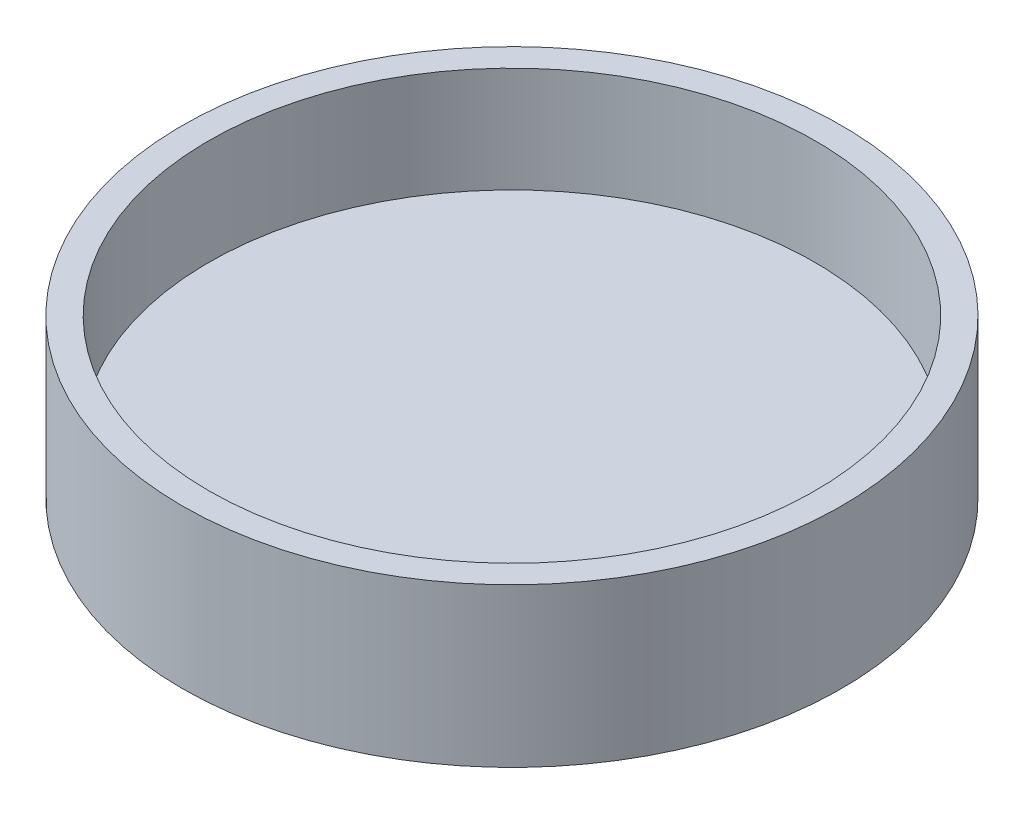
ISO-10303-21;
HEADER;
FILE_DESCRIPTION(('STEP AP214'),'2;1');
FILE_NAME('part.step','',(''),(''),'','','');
FILE_SCHEMA(('AUTOMOTIVE_DESIGN { 1 0 10303 214 1 1 1 1 }'));
ENDSEC;
DATA;
#1=APPLICATION_CONTEXT('core data for automotive mechanical design processes');
#2=APPLICATION_PROTOCOL_DEFINITION('international standard','automotive_design',2000,#1);
#3=PRODUCT_CONTEXT('',#1,'mechanical');
#4=PRODUCT('Part','Part','',(#3));
#5=PRODUCT_RELATED_PRODUCT_CATEGORY('part','',(#4));
#6=PRODUCT_DEFINITION_FORMATION('','',#4);
#7=PRODUCT_DEFINITION_CONTEXT('part definition',#1,'design');
#8=PRODUCT_DEFINITION('design','',#6,#7);
#9=PRODUCT_DEFINITION_SHAPE('','',#8);
#10=(LENGTH_UNIT() NAMED_UNIT(*) SI_UNIT(.MILLI.,.METRE.));
#11=(NAMED_UNIT(*) PLANE_ANGLE_UNIT() SI_UNIT($,.RADIAN.));
#12=(NAMED_UNIT(*) SI_UNIT($,.STERADIAN.) SOLID_ANGLE_UNIT());
#13=UNCERTAINTY_MEASURE_WITH_UNIT(LENGTH_MEASURE(1.E-05),#10,'distance_accuracy_value','');
#14=(GEOMETRIC_REPRESENTATION_CONTEXT(3) GLOBAL_UNCERTAINTY_ASSIGNED_CONTEXT((#13)) GLOBAL_UNIT_ASSIGNED_CONTEXT((#10,
#11,#12)) REPRESENTATION_CONTEXT('',''));
#15=CARTESIAN_POINT('',(0.,0.,0.));
#16=DIRECTION('',(0.,0.,1.));
#17=DIRECTION('',(1.,0.,0.));
#18=AXIS2_PLACEMENT_3D('',#15,#16,#17);
#19=CARTESIAN_POINT('',(0.,25.4,0.));
#20=DIRECTION('',(0.,-1.,0.));
#21=DIRECTION('',(0.,0.,-1.));
#22=AXIS2_PLACEMENT_3D('',#19,#20,#21);
#23=CYLINDRICAL_SURFACE('',#22,158.75);
#24=CARTESIAN_POINT('',(0.,0.,0.));
#25=DIRECTION('',(0.,1.,0.));
#26=DIRECTION('',(0.,0.,1.));
#27=AXIS2_PLACEMENT_3D('',#24,#25,#26);
#28=CIRCLE('',#27,158.75);
#29=CARTESIAN_POINT('',(0.,0.,158.75));
#30=VERTEX_POINT('',#29);
#31=EDGE_CURVE('E47',#30,#30,#28,.T.);
#32=ORIENTED_EDGE('',*,*,#31,.T.);
#33=EDGE_LOOP('',(#32));
#34=FACE_BOUND('',#33,.T.);
#35=CARTESIAN_POINT('',(0.,76.2,0.));
#36=DIRECTION('',(0.,1.,0.));
#37=DIRECTION('',(0.,0.,1.));
#38=AXIS2_PLACEMENT_3D('',#35,#36,#37);
#39=CIRCLE('',#38,158.75);
#40=CARTESIAN_POINT('',(0.,76.2,158.75));
#41=VERTEX_POINT('',#40);
#42=EDGE_CURVE('E52',#41,#41,#39,.T.);
#43=ORIENTED_EDGE('',*,*,#42,.F.);
#44=EDGE_LOOP('',(#43));
#45=FACE_BOUND('',#44,.T.);
#46=ADVANCED_FACE('F40',(#34,#45),#23,.T.);
#47=CARTESIAN_POINT('',(0.,0.,0.));
#48=DIRECTION('',(0.,1.,0.));
#49=DIRECTION('',(0.,0.,1.));
#50=AXIS2_PLACEMENT_3D('',#47,#48,#49);
#51=PLANE('',#50);
#52=ORIENTED_EDGE('',*,*,#31,.F.);
#53=EDGE_LOOP('',(#52));
#54=FACE_BOUND('',#53,.T.);
#55=ADVANCED_FACE('F68',(#54),#51,.F.);
#56=CARTESIAN_POINT('',(0.,76.2,0.));
#57=DIRECTION('',(0.,1.,0.));
#58=DIRECTION('',(0.,0.,1.));
#59=AXIS2_PLACEMENT_3D('',#56,#57,#58);
#60=PLANE('',#59);
#61=ORIENTED_EDGE('',*,*,#42,.T.);
#62=EDGE_LOOP('',(#61));
#63=FACE_BOUND('',#62,.T.);
#64=CARTESIAN_POINT('',(0.,76.2,0.));
#65=DIRECTION('',(0.,1.,0.));
#66=DIRECTION('',(0.,0.,1.));
#67=AXIS2_PLACEMENT_3D('',#64,#65,#66);
#68=CIRCLE('',#67,146.05);
#69=CARTESIAN_POINT('',(0.,76.2,146.05));
#70=VERTEX_POINT('',#69);
#71=EDGE_CURVE('E57',#70,#70,#68,.T.);
#72=ORIENTED_EDGE('',*,*,#71,.F.);
#73=EDGE_LOOP('',(#72));
#74=FACE_BOUND('',#73,.T.);
#75=ADVANCED_FACE('F66',(#63,#74),#60,.T.);
#76=CARTESIAN_POINT('',(0.,76.2,0.));
#77=DIRECTION('',(0.,-1.,0.));
#78=DIRECTION('',(0.,0.,-1.));
#79=AXIS2_PLACEMENT_3D('',#76,#77,#78);
#80=CYLINDRICAL_SURFACE('',#79,146.05);
#81=ORIENTED_EDGE('',*,*,#71,.T.);
#82=EDGE_LOOP('',(#81));
#83=FACE_BOUND('',#82,.T.);
#84=CARTESIAN_POINT('',(0.,25.4,0.));
#85=DIRECTION('',(0.,1.,0.));
#86=DIRECTION('',(0.,0.,1.));
#87=AXIS2_PLACEMENT_3D('',#84,#85,#86);
#88=CIRCLE('',#87,146.05);
#89=CARTESIAN_POINT('',(0.,25.4,146.05));
#90=VERTEX_POINT('',#89);
#91=EDGE_CURVE('E10',#90,#90,#88,.F.);
#92=ORIENTED_EDGE('',*,*,#91,.T.);
#93=EDGE_LOOP('',(#92));
#94=FACE_BOUND('',#93,.T.);
#95=ADVANCED_FACE('F64',(#83,#94),#80,.F.);
#96=CARTESIAN_POINT('',(0.,25.4,0.));
#97=DIRECTION('',(0.,1.,0.));
#98=DIRECTION('',(0.,0.,1.));
#99=AXIS2_PLACEMENT_3D('',#96,#97,#98);
#100=PLANE('',#99);
#101=ORIENTED_EDGE('',*,*,#91,.F.);
#102=EDGE_LOOP('',(#101));
#103=FACE_BOUND('',#102,.T.);
#104=ADVANCED_FACE('F75',(#103),#100,.T.);
#105=CLOSED_SHELL('',(#46,#55,#75,#95,#104));
#106=MANIFOLD_SOLID_BREP('B2',#105);
#107=ADVANCED_BREP_SHAPE_REPRESENTATION('',(#18,#106),#14);
#108=SHAPE_DEFINITION_REPRESENTATION(#9,#107);
ENDSEC;
END-ISO-10303-21;
